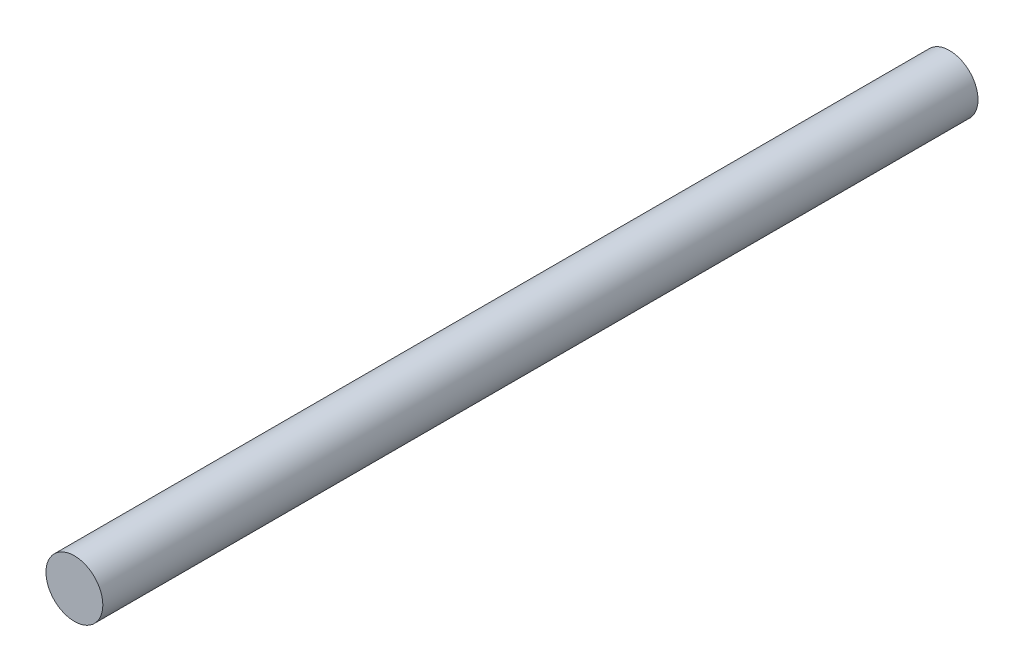
ISO-10303-21;
HEADER;
FILE_DESCRIPTION(('STEP AP214'),'2;1');
FILE_NAME('part.step','',(''),(''),'','','');
FILE_SCHEMA(('AUTOMOTIVE_DESIGN { 1 0 10303 214 1 1 1 1 }'));
ENDSEC;
DATA;
#1=APPLICATION_CONTEXT('core data for automotive mechanical design processes');
#2=APPLICATION_PROTOCOL_DEFINITION('international standard','automotive_design',2000,#1);
#3=PRODUCT_CONTEXT('',#1,'mechanical');
#4=PRODUCT('Part','Part','',(#3));
#5=PRODUCT_RELATED_PRODUCT_CATEGORY('part','',(#4));
#6=PRODUCT_DEFINITION_FORMATION('','',#4);
#7=PRODUCT_DEFINITION_CONTEXT('part definition',#1,'design');
#8=PRODUCT_DEFINITION('design','',#6,#7);
#9=PRODUCT_DEFINITION_SHAPE('','',#8);
#10=(LENGTH_UNIT() NAMED_UNIT(*) SI_UNIT(.MILLI.,.METRE.));
#11=(NAMED_UNIT(*) PLANE_ANGLE_UNIT() SI_UNIT($,.RADIAN.));
#12=(NAMED_UNIT(*) SI_UNIT($,.STERADIAN.) SOLID_ANGLE_UNIT());
#13=UNCERTAINTY_MEASURE_WITH_UNIT(LENGTH_MEASURE(1.E-05),#10,'distance_accuracy_value','');
#14=(GEOMETRIC_REPRESENTATION_CONTEXT(3) GLOBAL_UNCERTAINTY_ASSIGNED_CONTEXT((#13)) GLOBAL_UNIT_ASSIGNED_CONTEXT((#10,
#11,#12)) REPRESENTATION_CONTEXT('',''));
#15=CARTESIAN_POINT('',(0.,0.,0.));
#16=DIRECTION('',(0.,0.,1.));
#17=DIRECTION('',(1.,0.,0.));
#18=AXIS2_PLACEMENT_3D('',#15,#16,#17);
#19=CARTESIAN_POINT('',(0.,0.,50.8));
#20=DIRECTION('',(0.,0.,-1.));
#21=DIRECTION('',(-1.,0.,0.));
#22=AXIS2_PLACEMENT_3D('',#19,#20,#21);
#23=CYLINDRICAL_SURFACE('',#22,1.651);
#24=CARTESIAN_POINT('',(0.,0.,50.8));
#25=DIRECTION('',(0.,0.,1.));
#26=DIRECTION('',(1.,0.,0.));
#27=AXIS2_PLACEMENT_3D('',#24,#25,#26);
#28=CIRCLE('',#27,1.651);
#29=CARTESIAN_POINT('',(1.651,0.,50.8));
#30=VERTEX_POINT('',#29);
#31=EDGE_CURVE('E10',#30,#30,#28,.T.);
#32=ORIENTED_EDGE('',*,*,#31,.F.);
#33=EDGE_LOOP('',(#32));
#34=FACE_BOUND('',#33,.T.);
#35=CARTESIAN_POINT('',(0.,0.,0.));
#36=DIRECTION('',(0.,0.,1.));
#37=DIRECTION('',(1.,0.,0.));
#38=AXIS2_PLACEMENT_3D('',#35,#36,#37);
#39=CIRCLE('',#38,1.651);
#40=CARTESIAN_POINT('',(1.651,0.,0.));
#41=VERTEX_POINT('',#40);
#42=EDGE_CURVE('E40',#41,#41,#39,.T.);
#43=ORIENTED_EDGE('',*,*,#42,.T.);
#44=EDGE_LOOP('',(#43));
#45=FACE_BOUND('',#44,.T.);
#46=ADVANCED_FACE('F37',(#34,#45),#23,.T.);
#47=CARTESIAN_POINT('',(0.,0.,50.8));
#48=DIRECTION('',(0.,0.,1.));
#49=DIRECTION('',(1.,0.,0.));
#50=AXIS2_PLACEMENT_3D('',#47,#48,#49);
#51=PLANE('',#50);
#52=ORIENTED_EDGE('',*,*,#31,.T.);
#53=EDGE_LOOP('',(#52));
#54=FACE_BOUND('',#53,.T.);
#55=ADVANCED_FACE('F54',(#54),#51,.T.);
#56=CARTESIAN_POINT('',(0.,0.,0.));
#57=DIRECTION('',(0.,0.,1.));
#58=DIRECTION('',(1.,0.,0.));
#59=AXIS2_PLACEMENT_3D('',#56,#57,#58);
#60=PLANE('',#59);
#61=ORIENTED_EDGE('',*,*,#42,.F.);
#62=EDGE_LOOP('',(#61));
#63=FACE_BOUND('',#62,.T.);
#64=ADVANCED_FACE('F52',(#63),#60,.F.);
#65=CLOSED_SHELL('',(#46,#55,#64));
#66=MANIFOLD_SOLID_BREP('B2',#65);
#67=ADVANCED_BREP_SHAPE_REPRESENTATION('',(#18,#66),#14);
#68=SHAPE_DEFINITION_REPRESENTATION(#9,#67);
ENDSEC;
END-ISO-10303-21;
